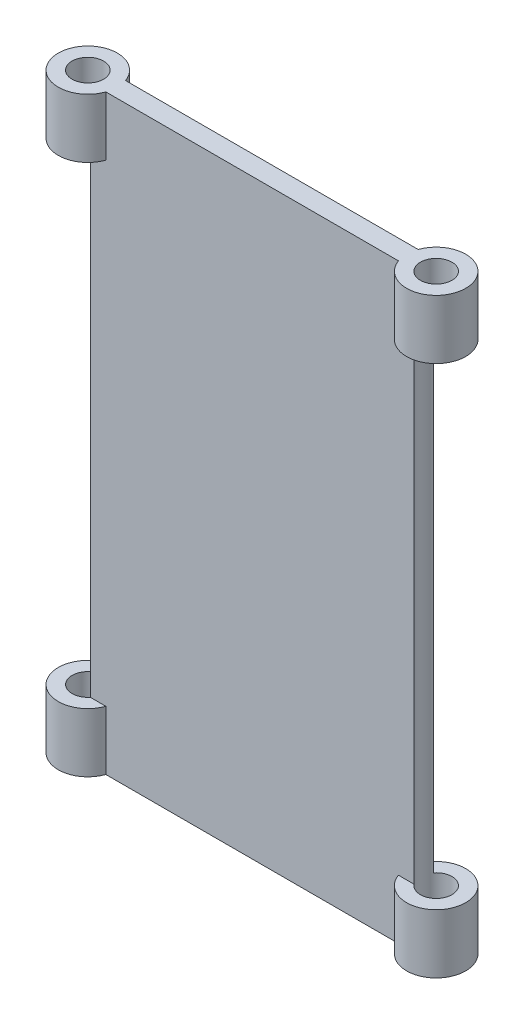
ISO-10303-21;
HEADER;
FILE_DESCRIPTION(('STEP AP214'),'2;1');
FILE_NAME('part.step','',(''),(''),'','','');
FILE_SCHEMA(('AUTOMOTIVE_DESIGN { 1 0 10303 214 1 1 1 1 }'));
ENDSEC;
DATA;
#1=APPLICATION_CONTEXT('core data for automotive mechanical design processes');
#2=APPLICATION_PROTOCOL_DEFINITION('international standard','automotive_design',2000,#1);
#3=PRODUCT_CONTEXT('',#1,'mechanical');
#4=PRODUCT('Part','Part','',(#3));
#5=PRODUCT_RELATED_PRODUCT_CATEGORY('part','',(#4));
#6=PRODUCT_DEFINITION_FORMATION('','',#4);
#7=PRODUCT_DEFINITION_CONTEXT('part definition',#1,'design');
#8=PRODUCT_DEFINITION('design','',#6,#7);
#9=PRODUCT_DEFINITION_SHAPE('','',#8);
#10=(LENGTH_UNIT() NAMED_UNIT(*) SI_UNIT(.MILLI.,.METRE.));
#11=(NAMED_UNIT(*) PLANE_ANGLE_UNIT() SI_UNIT($,.RADIAN.));
#12=(NAMED_UNIT(*) SI_UNIT($,.STERADIAN.) SOLID_ANGLE_UNIT());
#13=UNCERTAINTY_MEASURE_WITH_UNIT(LENGTH_MEASURE(1.E-05),#10,'distance_accuracy_value','');
#14=(GEOMETRIC_REPRESENTATION_CONTEXT(3) GLOBAL_UNCERTAINTY_ASSIGNED_CONTEXT((#13)) GLOBAL_UNIT_ASSIGNED_CONTEXT((#10,
#11,#12)) REPRESENTATION_CONTEXT('',''));
#15=CARTESIAN_POINT('',(0.,0.,0.));
#16=DIRECTION('',(0.,0.,1.));
#17=DIRECTION('',(1.,0.,0.));
#18=AXIS2_PLACEMENT_3D('',#15,#16,#17);
#19=CARTESIAN_POINT('',(88.39,150.,2.5));
#20=DIRECTION('',(0.,1.,0.));
#21=DIRECTION('',(0.,0.,1.));
#22=AXIS2_PLACEMENT_3D('',#19,#20,#21);
#23=CYLINDRICAL_SURFACE('',#22,4.);
#24=CARTESIAN_POINT('',(88.39,150.,2.5));
#25=DIRECTION('',(0.,1.,0.));
#26=DIRECTION('',(0.,0.,1.));
#27=AXIS2_PLACEMENT_3D('',#24,#25,#26);
#28=CIRCLE('',#27,4.00000000000002);
#29=CARTESIAN_POINT('',(88.39,150.,6.50000000000002));
#30=VERTEX_POINT('',#29);
#31=EDGE_CURVE('E152',#30,#30,#28,.T.);
#32=ORIENTED_EDGE('',*,*,#31,.T.);
#33=EDGE_LOOP('',(#32));
#34=FACE_BOUND('',#33,.T.);
#35=DIRECTION('',(0.,1.,0.));
#36=VECTOR('',#35,1.);
#37=CARTESIAN_POINT('',(85.2675010008008,150.,5.));
#38=LINE('',#37,#36);
#39=CARTESIAN_POINT('',(85.2675010008008,15.,5.));
#40=VERTEX_POINT('',#39);
#41=CARTESIAN_POINT('',(85.2675010008008,135.,5.));
#42=VERTEX_POINT('',#41);
#43=EDGE_CURVE('E134',#40,#42,#38,.T.);
#44=ORIENTED_EDGE('',*,*,#43,.F.);
#45=CARTESIAN_POINT('',(88.39,15.,2.5));
#46=DIRECTION('',(0.,-1.,0.));
#47=DIRECTION('',(0.,0.,-1.));
#48=AXIS2_PLACEMENT_3D('',#45,#46,#47);
#49=CIRCLE('',#48,4.00000000000002);
#50=CARTESIAN_POINT('',(85.2675010008008,15.,0.));
#51=VERTEX_POINT('',#50);
#52=EDGE_CURVE('E47',#51,#40,#49,.T.);
#53=ORIENTED_EDGE('',*,*,#52,.F.);
#54=DIRECTION('',(0.,1.,0.));
#55=VECTOR('',#54,1.);
#56=CARTESIAN_POINT('',(85.2675010008008,150.,0.));
#57=LINE('',#56,#55);
#58=CARTESIAN_POINT('',(85.2675010008008,135.,0.));
#59=VERTEX_POINT('',#58);
#60=EDGE_CURVE('E132',#51,#59,#57,.T.);
#61=ORIENTED_EDGE('',*,*,#60,.T.);
#62=CARTESIAN_POINT('',(88.39,135.,2.5));
#63=DIRECTION('',(0.,1.,0.));
#64=DIRECTION('',(0.,0.,1.));
#65=AXIS2_PLACEMENT_3D('',#62,#63,#64);
#66=CIRCLE('',#65,4.);
#67=EDGE_CURVE('E200',#42,#59,#66,.T.);
#68=ORIENTED_EDGE('',*,*,#67,.F.);
#69=EDGE_LOOP('',(#44,#53,#61,#68));
#70=FACE_BOUND('',#69,.T.);
#71=CARTESIAN_POINT('',(88.39,0.,2.5));
#72=DIRECTION('',(0.,1.,0.));
#73=DIRECTION('',(0.,0.,1.));
#74=AXIS2_PLACEMENT_3D('',#71,#72,#73);
#75=CIRCLE('',#74,4.00000000000002);
#76=CARTESIAN_POINT('',(88.39,0.,6.50000000000002));
#77=VERTEX_POINT('',#76);
#78=EDGE_CURVE('E312',#77,#77,#75,.T.);
#79=ORIENTED_EDGE('',*,*,#78,.F.);
#80=EDGE_LOOP('',(#79));
#81=FACE_BOUND('',#80,.T.);
#82=ADVANCED_FACE('F39',(#34,#70,#81),#23,.F.);
#83=CARTESIAN_POINT('',(0.,150.,2.5));
#84=DIRECTION('',(0.,1.,0.));
#85=DIRECTION('',(0.,0.,1.));
#86=AXIS2_PLACEMENT_3D('',#83,#84,#85);
#87=CYLINDRICAL_SURFACE('',#86,4.);
#88=CARTESIAN_POINT('',(0.,150.,2.5));
#89=DIRECTION('',(0.,1.,0.));
#90=DIRECTION('',(0.,0.,1.));
#91=AXIS2_PLACEMENT_3D('',#88,#89,#90);
#92=CIRCLE('',#91,4.00000000000001);
#93=CARTESIAN_POINT('',(0.,150.,6.50000000000001));
#94=VERTEX_POINT('',#93);
#95=EDGE_CURVE('E240',#94,#94,#92,.T.);
#96=ORIENTED_EDGE('',*,*,#95,.T.);
#97=EDGE_LOOP('',(#96));
#98=FACE_BOUND('',#97,.T.);
#99=DIRECTION('',(0.,1.,0.));
#100=VECTOR('',#99,1.);
#101=CARTESIAN_POINT('',(3.12249899919921,150.,0.));
#102=LINE('',#101,#100);
#103=CARTESIAN_POINT('',(3.12249899919921,135.,0.));
#104=VERTEX_POINT('',#103);
#105=CARTESIAN_POINT('',(3.12249899919919,15.,0.));
#106=VERTEX_POINT('',#105);
#107=EDGE_CURVE('E138',#104,#106,#102,.F.);
#108=ORIENTED_EDGE('',*,*,#107,.T.);
#109=CARTESIAN_POINT('',(0.,15.,2.5));
#110=DIRECTION('',(0.,-1.,0.));
#111=DIRECTION('',(0.,0.,-1.));
#112=AXIS2_PLACEMENT_3D('',#109,#110,#111);
#113=CIRCLE('',#112,4.00000000000001);
#114=CARTESIAN_POINT('',(3.12249899919921,15.,5.));
#115=VERTEX_POINT('',#114);
#116=EDGE_CURVE('E11',#115,#106,#113,.T.);
#117=ORIENTED_EDGE('',*,*,#116,.F.);
#118=DIRECTION('',(0.,1.,0.));
#119=VECTOR('',#118,1.);
#120=CARTESIAN_POINT('',(3.12249899919921,150.,5.));
#121=LINE('',#120,#119);
#122=CARTESIAN_POINT('',(3.12249899919921,135.,5.));
#123=VERTEX_POINT('',#122);
#124=EDGE_CURVE('E157',#123,#115,#121,.F.);
#125=ORIENTED_EDGE('',*,*,#124,.F.);
#126=CARTESIAN_POINT('',(0.,135.,2.5));
#127=DIRECTION('',(0.,1.,0.));
#128=DIRECTION('',(0.,0.,1.));
#129=AXIS2_PLACEMENT_3D('',#126,#127,#128);
#130=CIRCLE('',#129,4.);
#131=EDGE_CURVE('E54',#104,#123,#130,.T.);
#132=ORIENTED_EDGE('',*,*,#131,.F.);
#133=EDGE_LOOP('',(#108,#117,#125,#132));
#134=FACE_BOUND('',#133,.T.);
#135=CARTESIAN_POINT('',(0.,0.,2.5));
#136=DIRECTION('',(0.,1.,0.));
#137=DIRECTION('',(0.,0.,1.));
#138=AXIS2_PLACEMENT_3D('',#135,#136,#137);
#139=CIRCLE('',#138,4.00000000000001);
#140=CARTESIAN_POINT('',(0.,0.,6.50000000000001));
#141=VERTEX_POINT('',#140);
#142=EDGE_CURVE('E247',#141,#141,#139,.T.);
#143=ORIENTED_EDGE('',*,*,#142,.F.);
#144=EDGE_LOOP('',(#143));
#145=FACE_BOUND('',#144,.T.);
#146=ADVANCED_FACE('F202',(#98,#134,#145),#87,.F.);
#147=CARTESIAN_POINT('',(0.,150.,5.));
#148=DIRECTION('',(0.,-1.,0.));
#149=DIRECTION('',(0.,0.,-1.));
#150=AXIS2_PLACEMENT_3D('',#147,#148,#149);
#151=PLANE('',#150);
#152=ORIENTED_EDGE('',*,*,#95,.F.);
#153=EDGE_LOOP('',(#152));
#154=FACE_BOUND('',#153,.T.);
#155=DIRECTION('',(-1.,0.,0.));
#156=VECTOR('',#155,1.);
#157=CARTESIAN_POINT('',(0.,150.,5.));
#158=LINE('',#157,#156);
#159=CARTESIAN_POINT('',(81.3189321881345,150.,5.));
#160=VERTEX_POINT('',#159);
#161=CARTESIAN_POINT('',(7.07106781186548,150.,5.));
#162=VERTEX_POINT('',#161);
#163=EDGE_CURVE('E185',#160,#162,#158,.T.);
#164=ORIENTED_EDGE('',*,*,#163,.F.);
#165=CARTESIAN_POINT('',(88.39,150.,2.5));
#166=DIRECTION('',(0.,1.,0.));
#167=DIRECTION('',(0.,0.,1.));
#168=AXIS2_PLACEMENT_3D('',#165,#166,#167);
#169=CIRCLE('',#168,7.50000000000001);
#170=CARTESIAN_POINT('',(81.3189321881345,150.,0.));
#171=VERTEX_POINT('',#170);
#172=EDGE_CURVE('E62',#160,#171,#169,.T.);
#173=ORIENTED_EDGE('',*,*,#172,.T.);
#174=DIRECTION('',(-1.,0.,0.));
#175=VECTOR('',#174,1.);
#176=CARTESIAN_POINT('',(0.,150.,0.));
#177=LINE('',#176,#175);
#178=CARTESIAN_POINT('',(7.07106781186548,150.,0.));
#179=VERTEX_POINT('',#178);
#180=EDGE_CURVE('E186',#171,#179,#177,.T.);
#181=ORIENTED_EDGE('',*,*,#180,.T.);
#182=CARTESIAN_POINT('',(0.,150.,2.5));
#183=DIRECTION('',(0.,1.,0.));
#184=DIRECTION('',(0.,0.,1.));
#185=AXIS2_PLACEMENT_3D('',#182,#183,#184);
#186=CIRCLE('',#185,7.5);
#187=EDGE_CURVE('E166',#179,#162,#186,.T.);
#188=ORIENTED_EDGE('',*,*,#187,.T.);
#189=EDGE_LOOP('',(#164,#173,#181,#188));
#190=FACE_BOUND('',#189,.T.);
#191=ORIENTED_EDGE('',*,*,#31,.F.);
#192=EDGE_LOOP('',(#191));
#193=FACE_BOUND('',#192,.T.);
#194=ADVANCED_FACE('F221',(#154,#190,#193),#151,.F.);
#195=CARTESIAN_POINT('',(0.,0.,5.));
#196=DIRECTION('',(0.,1.,0.));
#197=DIRECTION('',(0.,0.,1.));
#198=AXIS2_PLACEMENT_3D('',#195,#196,#197);
#199=PLANE('',#198);
#200=ORIENTED_EDGE('',*,*,#142,.T.);
#201=EDGE_LOOP('',(#200));
#202=FACE_BOUND('',#201,.T.);
#203=ORIENTED_EDGE('',*,*,#78,.T.);
#204=EDGE_LOOP('',(#203));
#205=FACE_BOUND('',#204,.T.);
#206=DIRECTION('',(1.,0.,0.));
#207=VECTOR('',#206,1.);
#208=CARTESIAN_POINT('',(0.,0.,5.));
#209=LINE('',#208,#207);
#210=CARTESIAN_POINT('',(7.07106781186548,0.,5.));
#211=VERTEX_POINT('',#210);
#212=CARTESIAN_POINT('',(81.3189321881345,0.,5.));
#213=VERTEX_POINT('',#212);
#214=EDGE_CURVE('E182',#211,#213,#209,.T.);
#215=ORIENTED_EDGE('',*,*,#214,.F.);
#216=CARTESIAN_POINT('',(0.,0.,2.5));
#217=DIRECTION('',(0.,-1.,0.));
#218=DIRECTION('',(0.,0.,-1.));
#219=AXIS2_PLACEMENT_3D('',#216,#217,#218);
#220=CIRCLE('',#219,7.5);
#221=CARTESIAN_POINT('',(7.07106781186548,0.,0.));
#222=VERTEX_POINT('',#221);
#223=EDGE_CURVE('E239',#211,#222,#220,.T.);
#224=ORIENTED_EDGE('',*,*,#223,.T.);
#225=DIRECTION('',(1.,0.,0.));
#226=VECTOR('',#225,1.);
#227=CARTESIAN_POINT('',(0.,0.,0.));
#228=LINE('',#227,#226);
#229=CARTESIAN_POINT('',(81.3189321881345,0.,0.));
#230=VERTEX_POINT('',#229);
#231=EDGE_CURVE('E181',#222,#230,#228,.T.);
#232=ORIENTED_EDGE('',*,*,#231,.T.);
#233=CARTESIAN_POINT('',(88.39,0.,2.5));
#234=DIRECTION('',(0.,-1.,0.));
#235=DIRECTION('',(0.,0.,-1.));
#236=AXIS2_PLACEMENT_3D('',#233,#234,#235);
#237=CIRCLE('',#236,7.50000000000002);
#238=EDGE_CURVE('E146',#230,#213,#237,.T.);
#239=ORIENTED_EDGE('',*,*,#238,.T.);
#240=EDGE_LOOP('',(#215,#224,#232,#239));
#241=FACE_BOUND('',#240,.T.);
#242=ADVANCED_FACE('F41',(#202,#205,#241),#199,.F.);
#243=CARTESIAN_POINT('',(0.,0.,5.));
#244=DIRECTION('',(0.,0.,-1.));
#245=DIRECTION('',(-1.,0.,0.));
#246=AXIS2_PLACEMENT_3D('',#243,#244,#245);
#247=PLANE('',#246);
#248=ORIENTED_EDGE('',*,*,#214,.T.);
#249=DIRECTION('',(0.,-1.,0.));
#250=VECTOR('',#249,1.);
#251=CARTESIAN_POINT('',(81.3189321881345,15.,5.));
#252=LINE('',#251,#250);
#253=CARTESIAN_POINT('',(81.3189321881345,15.,5.));
#254=VERTEX_POINT('',#253);
#255=EDGE_CURVE('E231',#254,#213,#252,.T.);
#256=ORIENTED_EDGE('',*,*,#255,.F.);
#257=DIRECTION('',(1.,0.,0.));
#258=VECTOR('',#257,1.);
#259=CARTESIAN_POINT('',(81.3189321881345,15.,5.));
#260=LINE('',#259,#258);
#261=EDGE_CURVE('E230',#254,#40,#260,.T.);
#262=ORIENTED_EDGE('',*,*,#261,.T.);
#263=ORIENTED_EDGE('',*,*,#43,.T.);
#264=DIRECTION('',(1.,0.,0.));
#265=VECTOR('',#264,1.);
#266=CARTESIAN_POINT('',(0.,135.,5.));
#267=LINE('',#266,#265);
#268=CARTESIAN_POINT('',(81.3189321881345,135.,5.));
#269=VERTEX_POINT('',#268);
#270=EDGE_CURVE('E175',#269,#42,#267,.T.);
#271=ORIENTED_EDGE('',*,*,#270,.F.);
#272=DIRECTION('',(0.,1.,0.));
#273=VECTOR('',#272,1.);
#274=CARTESIAN_POINT('',(81.3189321881345,135.,5.));
#275=LINE('',#274,#273);
#276=EDGE_CURVE('E178',#269,#160,#275,.T.);
#277=ORIENTED_EDGE('',*,*,#276,.T.);
#278=ORIENTED_EDGE('',*,*,#163,.T.);
#279=DIRECTION('',(0.,1.,0.));
#280=VECTOR('',#279,1.);
#281=CARTESIAN_POINT('',(7.07106781186548,135.,5.));
#282=LINE('',#281,#280);
#283=CARTESIAN_POINT('',(7.07106781186548,135.,5.));
#284=VERTEX_POINT('',#283);
#285=EDGE_CURVE('E172',#162,#284,#282,.F.);
#286=ORIENTED_EDGE('',*,*,#285,.T.);
#287=DIRECTION('',(1.,0.,0.));
#288=VECTOR('',#287,1.);
#289=CARTESIAN_POINT('',(0.,135.,5.));
#290=LINE('',#289,#288);
#291=EDGE_CURVE('E164',#123,#284,#290,.T.);
#292=ORIENTED_EDGE('',*,*,#291,.F.);
#293=ORIENTED_EDGE('',*,*,#124,.T.);
#294=DIRECTION('',(1.,0.,0.));
#295=VECTOR('',#294,1.);
#296=CARTESIAN_POINT('',(3.1224989991992,15.,4.99999999999999));
#297=LINE('',#296,#295);
#298=CARTESIAN_POINT('',(7.07106781186548,15.,5.));
#299=VERTEX_POINT('',#298);
#300=EDGE_CURVE('E250',#115,#299,#297,.T.);
#301=ORIENTED_EDGE('',*,*,#300,.T.);
#302=DIRECTION('',(0.,-1.,0.));
#303=VECTOR('',#302,1.);
#304=CARTESIAN_POINT('',(7.07106781186548,15.,5.));
#305=LINE('',#304,#303);
#306=EDGE_CURVE('E242',#299,#211,#305,.T.);
#307=ORIENTED_EDGE('',*,*,#306,.T.);
#308=EDGE_LOOP('',(#248,#256,#262,#263,#271,#277,#278,#286,#292,#293,#301,#307));
#309=FACE_BOUND('',#308,.T.);
#310=ADVANCED_FACE('F218',(#309),#247,.F.);
#311=CARTESIAN_POINT('',(0.,0.,0.));
#312=DIRECTION('',(0.,0.,-1.));
#313=DIRECTION('',(-1.,0.,0.));
#314=AXIS2_PLACEMENT_3D('',#311,#312,#313);
#315=PLANE('',#314);
#316=DIRECTION('',(0.,-1.,0.));
#317=VECTOR('',#316,1.);
#318=CARTESIAN_POINT('',(81.3189321881345,15.,0.));
#319=LINE('',#318,#317);
#320=CARTESIAN_POINT('',(81.3189321881345,15.,0.));
#321=VERTEX_POINT('',#320);
#322=EDGE_CURVE('E232',#321,#230,#319,.T.);
#323=ORIENTED_EDGE('',*,*,#322,.T.);
#324=ORIENTED_EDGE('',*,*,#231,.F.);
#325=DIRECTION('',(0.,-1.,0.));
#326=VECTOR('',#325,1.);
#327=CARTESIAN_POINT('',(7.07106781186548,15.,0.));
#328=LINE('',#327,#326);
#329=CARTESIAN_POINT('',(7.07106781186548,15.,0.));
#330=VERTEX_POINT('',#329);
#331=EDGE_CURVE('E245',#330,#222,#328,.T.);
#332=ORIENTED_EDGE('',*,*,#331,.F.);
#333=DIRECTION('',(-1.,0.,0.));
#334=VECTOR('',#333,1.);
#335=CARTESIAN_POINT('',(3.12249899919919,15.,0.));
#336=LINE('',#335,#334);
#337=EDGE_CURVE('E210',#330,#106,#336,.T.);
#338=ORIENTED_EDGE('',*,*,#337,.T.);
#339=ORIENTED_EDGE('',*,*,#107,.F.);
#340=DIRECTION('',(1.,0.,0.));
#341=VECTOR('',#340,1.);
#342=CARTESIAN_POINT('',(0.,135.,0.));
#343=LINE('',#342,#341);
#344=CARTESIAN_POINT('',(7.07106781186548,135.,0.));
#345=VERTEX_POINT('',#344);
#346=EDGE_CURVE('E189',#104,#345,#343,.T.);
#347=ORIENTED_EDGE('',*,*,#346,.T.);
#348=DIRECTION('',(0.,1.,0.));
#349=VECTOR('',#348,1.);
#350=CARTESIAN_POINT('',(7.07106781186548,135.,0.));
#351=LINE('',#350,#349);
#352=EDGE_CURVE('E194',#179,#345,#351,.F.);
#353=ORIENTED_EDGE('',*,*,#352,.F.);
#354=ORIENTED_EDGE('',*,*,#180,.F.);
#355=DIRECTION('',(0.,1.,0.));
#356=VECTOR('',#355,1.);
#357=CARTESIAN_POINT('',(81.3189321881345,135.,0.));
#358=LINE('',#357,#356);
#359=CARTESIAN_POINT('',(81.3189321881345,135.,0.));
#360=VERTEX_POINT('',#359);
#361=EDGE_CURVE('E198',#360,#171,#358,.T.);
#362=ORIENTED_EDGE('',*,*,#361,.F.);
#363=DIRECTION('',(1.,0.,0.));
#364=VECTOR('',#363,1.);
#365=CARTESIAN_POINT('',(0.,135.,0.));
#366=LINE('',#365,#364);
#367=EDGE_CURVE('E151',#360,#59,#366,.T.);
#368=ORIENTED_EDGE('',*,*,#367,.T.);
#369=ORIENTED_EDGE('',*,*,#60,.F.);
#370=DIRECTION('',(-1.,0.,0.));
#371=VECTOR('',#370,1.);
#372=CARTESIAN_POINT('',(81.3189321881345,15.,0.));
#373=LINE('',#372,#371);
#374=EDGE_CURVE('E141',#51,#321,#373,.T.);
#375=ORIENTED_EDGE('',*,*,#374,.T.);
#376=EDGE_LOOP('',(#323,#324,#332,#338,#339,#347,#353,#354,#362,#368,#369,#375));
#377=FACE_BOUND('',#376,.T.);
#378=ADVANCED_FACE('F149',(#377),#315,.T.);
#379=CARTESIAN_POINT('',(0.,135.,2.5));
#380=DIRECTION('',(0.,1.,0.));
#381=DIRECTION('',(0.,0.,1.));
#382=AXIS2_PLACEMENT_3D('',#379,#380,#381);
#383=CYLINDRICAL_SURFACE('',#382,7.5);
#384=ORIENTED_EDGE('',*,*,#285,.F.);
#385=ORIENTED_EDGE('',*,*,#187,.F.);
#386=ORIENTED_EDGE('',*,*,#352,.T.);
#387=CARTESIAN_POINT('',(0.,135.,2.5));
#388=DIRECTION('',(0.,1.,0.));
#389=DIRECTION('',(0.,0.,1.));
#390=AXIS2_PLACEMENT_3D('',#387,#388,#389);
#391=CIRCLE('',#390,7.5);
#392=EDGE_CURVE('E154',#345,#284,#391,.T.);
#393=ORIENTED_EDGE('',*,*,#392,.T.);
#394=EDGE_LOOP('',(#384,#385,#386,#393));
#395=FACE_BOUND('',#394,.T.);
#396=ADVANCED_FACE('F216',(#395),#383,.T.);
#397=CARTESIAN_POINT('',(0.,135.,2.5));
#398=DIRECTION('',(0.,1.,0.));
#399=DIRECTION('',(0.,0.,1.));
#400=AXIS2_PLACEMENT_3D('',#397,#398,#399);
#401=PLANE('',#400);
#402=ORIENTED_EDGE('',*,*,#346,.F.);
#403=ORIENTED_EDGE('',*,*,#131,.T.);
#404=ORIENTED_EDGE('',*,*,#291,.T.);
#405=ORIENTED_EDGE('',*,*,#392,.F.);
#406=EDGE_LOOP('',(#402,#403,#404,#405));
#407=FACE_BOUND('',#406,.T.);
#408=ADVANCED_FACE('F213',(#407),#401,.F.);
#409=CARTESIAN_POINT('',(88.39,135.,2.5));
#410=DIRECTION('',(0.,1.,0.));
#411=DIRECTION('',(0.,0.,1.));
#412=AXIS2_PLACEMENT_3D('',#409,#410,#411);
#413=CYLINDRICAL_SURFACE('',#412,7.50000000000001);
#414=ORIENTED_EDGE('',*,*,#276,.F.);
#415=CARTESIAN_POINT('',(88.39,135.,2.5));
#416=DIRECTION('',(0.,1.,0.));
#417=DIRECTION('',(0.,0.,1.));
#418=AXIS2_PLACEMENT_3D('',#415,#416,#417);
#419=CIRCLE('',#418,7.50000000000001);
#420=EDGE_CURVE('E161',#269,#360,#419,.T.);
#421=ORIENTED_EDGE('',*,*,#420,.T.);
#422=ORIENTED_EDGE('',*,*,#361,.T.);
#423=ORIENTED_EDGE('',*,*,#172,.F.);
#424=EDGE_LOOP('',(#414,#421,#422,#423));
#425=FACE_BOUND('',#424,.T.);
#426=ADVANCED_FACE('F225',(#425),#413,.T.);
#427=CARTESIAN_POINT('',(88.39,135.,2.5));
#428=DIRECTION('',(0.,1.,0.));
#429=DIRECTION('',(0.,0.,1.));
#430=AXIS2_PLACEMENT_3D('',#427,#428,#429);
#431=PLANE('',#430);
#432=ORIENTED_EDGE('',*,*,#270,.T.);
#433=ORIENTED_EDGE('',*,*,#67,.T.);
#434=ORIENTED_EDGE('',*,*,#367,.F.);
#435=ORIENTED_EDGE('',*,*,#420,.F.);
#436=EDGE_LOOP('',(#432,#433,#434,#435));
#437=FACE_BOUND('',#436,.T.);
#438=ADVANCED_FACE('F228',(#437),#431,.F.);
#439=CARTESIAN_POINT('',(0.,15.,2.5));
#440=DIRECTION('',(0.,-1.,0.));
#441=DIRECTION('',(0.,0.,-1.));
#442=AXIS2_PLACEMENT_3D('',#439,#440,#441);
#443=CYLINDRICAL_SURFACE('',#442,7.5);
#444=ORIENTED_EDGE('',*,*,#223,.F.);
#445=ORIENTED_EDGE('',*,*,#306,.F.);
#446=CARTESIAN_POINT('',(0.,15.,2.5));
#447=DIRECTION('',(0.,-1.,0.));
#448=DIRECTION('',(0.,0.,-1.));
#449=AXIS2_PLACEMENT_3D('',#446,#447,#448);
#450=CIRCLE('',#449,7.5);
#451=EDGE_CURVE('E252',#299,#330,#450,.T.);
#452=ORIENTED_EDGE('',*,*,#451,.T.);
#453=ORIENTED_EDGE('',*,*,#331,.T.);
#454=EDGE_LOOP('',(#444,#445,#452,#453));
#455=FACE_BOUND('',#454,.T.);
#456=ADVANCED_FACE('F263',(#455),#443,.T.);
#457=CARTESIAN_POINT('',(0.,15.,2.5));
#458=DIRECTION('',(0.,-1.,0.));
#459=DIRECTION('',(0.,0.,-1.));
#460=AXIS2_PLACEMENT_3D('',#457,#458,#459);
#461=PLANE('',#460);
#462=ORIENTED_EDGE('',*,*,#300,.F.);
#463=ORIENTED_EDGE('',*,*,#116,.T.);
#464=ORIENTED_EDGE('',*,*,#337,.F.);
#465=ORIENTED_EDGE('',*,*,#451,.F.);
#466=EDGE_LOOP('',(#462,#463,#464,#465));
#467=FACE_BOUND('',#466,.T.);
#468=ADVANCED_FACE('F261',(#467),#461,.F.);
#469=CARTESIAN_POINT('',(88.39,15.,2.5));
#470=DIRECTION('',(0.,-1.,0.));
#471=DIRECTION('',(0.,0.,-1.));
#472=AXIS2_PLACEMENT_3D('',#469,#470,#471);
#473=CYLINDRICAL_SURFACE('',#472,7.50000000000002);
#474=ORIENTED_EDGE('',*,*,#238,.F.);
#475=ORIENTED_EDGE('',*,*,#322,.F.);
#476=CARTESIAN_POINT('',(88.39,15.,2.5));
#477=DIRECTION('',(0.,-1.,0.));
#478=DIRECTION('',(0.,0.,-1.));
#479=AXIS2_PLACEMENT_3D('',#476,#477,#478);
#480=CIRCLE('',#479,7.50000000000002);
#481=EDGE_CURVE('E143',#321,#254,#480,.T.);
#482=ORIENTED_EDGE('',*,*,#481,.T.);
#483=ORIENTED_EDGE('',*,*,#255,.T.);
#484=EDGE_LOOP('',(#474,#475,#482,#483));
#485=FACE_BOUND('',#484,.T.);
#486=ADVANCED_FACE('F267',(#485),#473,.T.);
#487=CARTESIAN_POINT('',(88.39,15.,2.5));
#488=DIRECTION('',(0.,-1.,0.));
#489=DIRECTION('',(0.,0.,-1.));
#490=AXIS2_PLACEMENT_3D('',#487,#488,#489);
#491=PLANE('',#490);
#492=ORIENTED_EDGE('',*,*,#374,.F.);
#493=ORIENTED_EDGE('',*,*,#52,.T.);
#494=ORIENTED_EDGE('',*,*,#261,.F.);
#495=ORIENTED_EDGE('',*,*,#481,.F.);
#496=EDGE_LOOP('',(#492,#493,#494,#495));
#497=FACE_BOUND('',#496,.T.);
#498=ADVANCED_FACE('F142',(#497),#491,.F.);
#499=CLOSED_SHELL('',(#82,#146,#194,#242,#310,#378,#396,#408,#426,#438,#456,#468,#486,#498));
#500=MANIFOLD_SOLID_BREP('B2',#499);
#501=ADVANCED_BREP_SHAPE_REPRESENTATION('',(#18,#500),#14);
#502=SHAPE_DEFINITION_REPRESENTATION(#9,#501);
ENDSEC;
END-ISO-10303-21;
